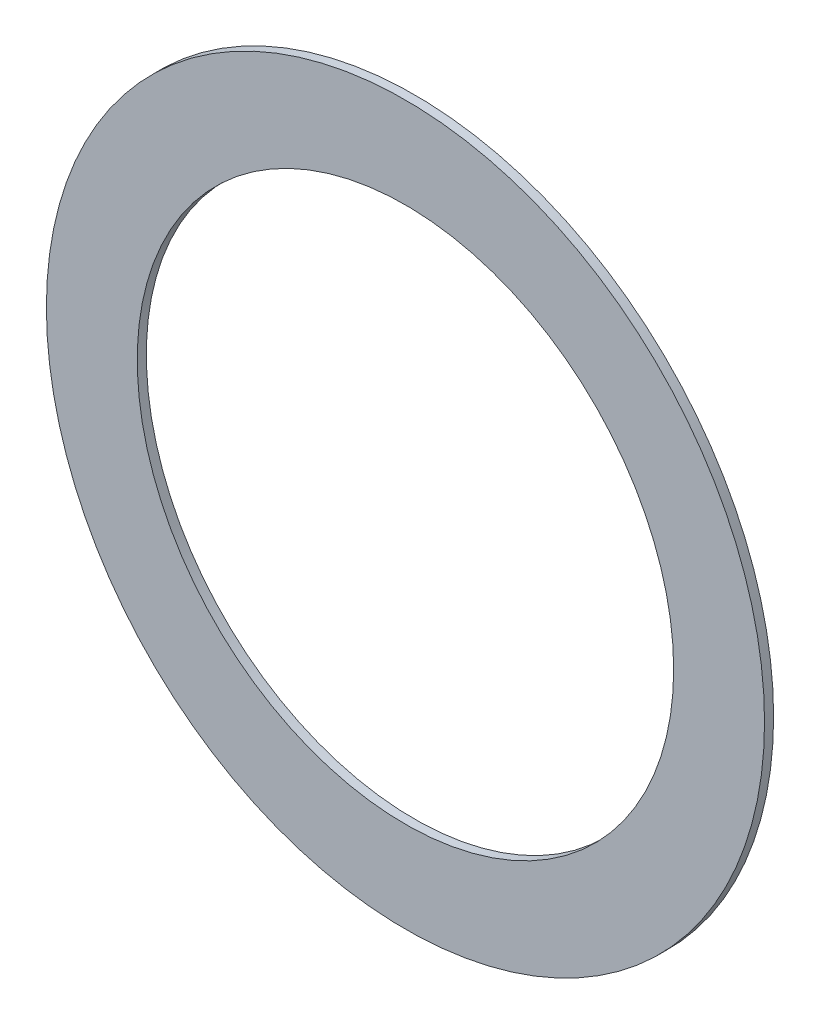
ISO-10303-21;
HEADER;
FILE_DESCRIPTION(('STEP AP214'),'2;1');
FILE_NAME('part.step','',(''),(''),'','','');
FILE_SCHEMA(('AUTOMOTIVE_DESIGN { 1 0 10303 214 1 1 1 1 }'));
ENDSEC;
DATA;
#1=APPLICATION_CONTEXT('core data for automotive mechanical design processes');
#2=APPLICATION_PROTOCOL_DEFINITION('international standard','automotive_design',2000,#1);
#3=PRODUCT_CONTEXT('',#1,'mechanical');
#4=PRODUCT('Part','Part','',(#3));
#5=PRODUCT_RELATED_PRODUCT_CATEGORY('part','',(#4));
#6=PRODUCT_DEFINITION_FORMATION('','',#4);
#7=PRODUCT_DEFINITION_CONTEXT('part definition',#1,'design');
#8=PRODUCT_DEFINITION('design','',#6,#7);
#9=PRODUCT_DEFINITION_SHAPE('','',#8);
#10=(LENGTH_UNIT() NAMED_UNIT(*) SI_UNIT(.MILLI.,.METRE.));
#11=(NAMED_UNIT(*) PLANE_ANGLE_UNIT() SI_UNIT($,.RADIAN.));
#12=(NAMED_UNIT(*) SI_UNIT($,.STERADIAN.) SOLID_ANGLE_UNIT());
#13=UNCERTAINTY_MEASURE_WITH_UNIT(LENGTH_MEASURE(1.E-05),#10,'distance_accuracy_value','');
#14=(GEOMETRIC_REPRESENTATION_CONTEXT(3) GLOBAL_UNCERTAINTY_ASSIGNED_CONTEXT((#13)) GLOBAL_UNIT_ASSIGNED_CONTEXT((#10,
#11,#12)) REPRESENTATION_CONTEXT('',''));
#15=CARTESIAN_POINT('',(0.,0.,0.));
#16=DIRECTION('',(0.,0.,1.));
#17=DIRECTION('',(1.,0.,0.));
#18=AXIS2_PLACEMENT_3D('',#15,#16,#17);
#19=CARTESIAN_POINT('',(-34.4761262861667,6.9674797503281,1.));
#20=DIRECTION('',(0.,0.,1.));
#21=DIRECTION('',(1.,0.,0.));
#22=AXIS2_PLACEMENT_3D('',#19,#20,#21);
#23=PLANE('',#22);
#24=CARTESIAN_POINT('',(-34.4761262861667,6.9674797503281,1.));
#25=DIRECTION('',(0.,0.,1.));
#26=DIRECTION('',(1.,0.,0.));
#27=AXIS2_PLACEMENT_3D('',#24,#25,#26);
#28=CIRCLE('',#27,39.522);
#29=CARTESIAN_POINT('',(5.04587371383333,6.9674797503281,1.));
#30=VERTEX_POINT('',#29);
#31=EDGE_CURVE('E10',#30,#30,#28,.T.);
#32=ORIENTED_EDGE('',*,*,#31,.T.);
#33=EDGE_LOOP('',(#32));
#34=FACE_BOUND('',#33,.T.);
#35=CARTESIAN_POINT('',(-34.4761262861667,6.9674797503281,1.));
#36=DIRECTION('',(0.,0.,1.));
#37=DIRECTION('',(1.,0.,0.));
#38=AXIS2_PLACEMENT_3D('',#35,#36,#37);
#39=CIRCLE('',#38,29.522);
#40=CARTESIAN_POINT('',(-4.95412628616667,6.9674797503281,1.));
#41=VERTEX_POINT('',#40);
#42=EDGE_CURVE('E41',#41,#41,#39,.T.);
#43=ORIENTED_EDGE('',*,*,#42,.F.);
#44=EDGE_LOOP('',(#43));
#45=FACE_BOUND('',#44,.T.);
#46=ADVANCED_FACE('F30',(#34,#45),#23,.T.);
#47=CARTESIAN_POINT('',(-34.4761262861667,6.9674797503281,0.));
#48=DIRECTION('',(0.,0.,1.));
#49=DIRECTION('',(1.,0.,0.));
#50=AXIS2_PLACEMENT_3D('',#47,#48,#49);
#51=PLANE('',#50);
#52=CARTESIAN_POINT('',(-34.4761262861667,6.9674797503281,0.));
#53=DIRECTION('',(0.,0.,1.));
#54=DIRECTION('',(1.,0.,0.));
#55=AXIS2_PLACEMENT_3D('',#52,#53,#54);
#56=CIRCLE('',#55,39.522);
#57=CARTESIAN_POINT('',(5.04587371383333,6.9674797503281,0.));
#58=VERTEX_POINT('',#57);
#59=EDGE_CURVE('E34',#58,#58,#56,.T.);
#60=ORIENTED_EDGE('',*,*,#59,.F.);
#61=EDGE_LOOP('',(#60));
#62=FACE_BOUND('',#61,.T.);
#63=CARTESIAN_POINT('',(-34.4761262861667,6.9674797503281,0.));
#64=DIRECTION('',(0.,0.,1.));
#65=DIRECTION('',(1.,0.,0.));
#66=AXIS2_PLACEMENT_3D('',#63,#64,#65);
#67=CIRCLE('',#66,29.522);
#68=CARTESIAN_POINT('',(-4.95412628616667,6.9674797503281,0.));
#69=VERTEX_POINT('',#68);
#70=EDGE_CURVE('E43',#69,#69,#67,.T.);
#71=ORIENTED_EDGE('',*,*,#70,.T.);
#72=EDGE_LOOP('',(#71));
#73=FACE_BOUND('',#72,.T.);
#74=ADVANCED_FACE('F53',(#62,#73),#51,.F.);
#75=CARTESIAN_POINT('',(-34.4761262861667,6.9674797503281,1.));
#76=DIRECTION('',(0.,0.,-1.));
#77=DIRECTION('',(-1.,0.,0.));
#78=AXIS2_PLACEMENT_3D('',#75,#76,#77);
#79=CYLINDRICAL_SURFACE('',#78,39.522);
#80=ORIENTED_EDGE('',*,*,#31,.F.);
#81=EDGE_LOOP('',(#80));
#82=FACE_BOUND('',#81,.T.);
#83=ORIENTED_EDGE('',*,*,#59,.T.);
#84=EDGE_LOOP('',(#83));
#85=FACE_BOUND('',#84,.T.);
#86=ADVANCED_FACE('F32',(#82,#85),#79,.T.);
#87=CARTESIAN_POINT('',(-34.4761262861667,6.9674797503281,1.));
#88=DIRECTION('',(0.,0.,-1.));
#89=DIRECTION('',(-1.,0.,0.));
#90=AXIS2_PLACEMENT_3D('',#87,#88,#89);
#91=CYLINDRICAL_SURFACE('',#90,29.522);
#92=ORIENTED_EDGE('',*,*,#42,.T.);
#93=EDGE_LOOP('',(#92));
#94=FACE_BOUND('',#93,.T.);
#95=ORIENTED_EDGE('',*,*,#70,.F.);
#96=EDGE_LOOP('',(#95));
#97=FACE_BOUND('',#96,.T.);
#98=ADVANCED_FACE('F49',(#94,#97),#91,.F.);
#99=CLOSED_SHELL('',(#46,#74,#86,#98));
#100=MANIFOLD_SOLID_BREP('B2',#99);
#101=ADVANCED_BREP_SHAPE_REPRESENTATION('',(#18,#100),#14);
#102=SHAPE_DEFINITION_REPRESENTATION(#9,#101);
ENDSEC;
END-ISO-10303-21;
